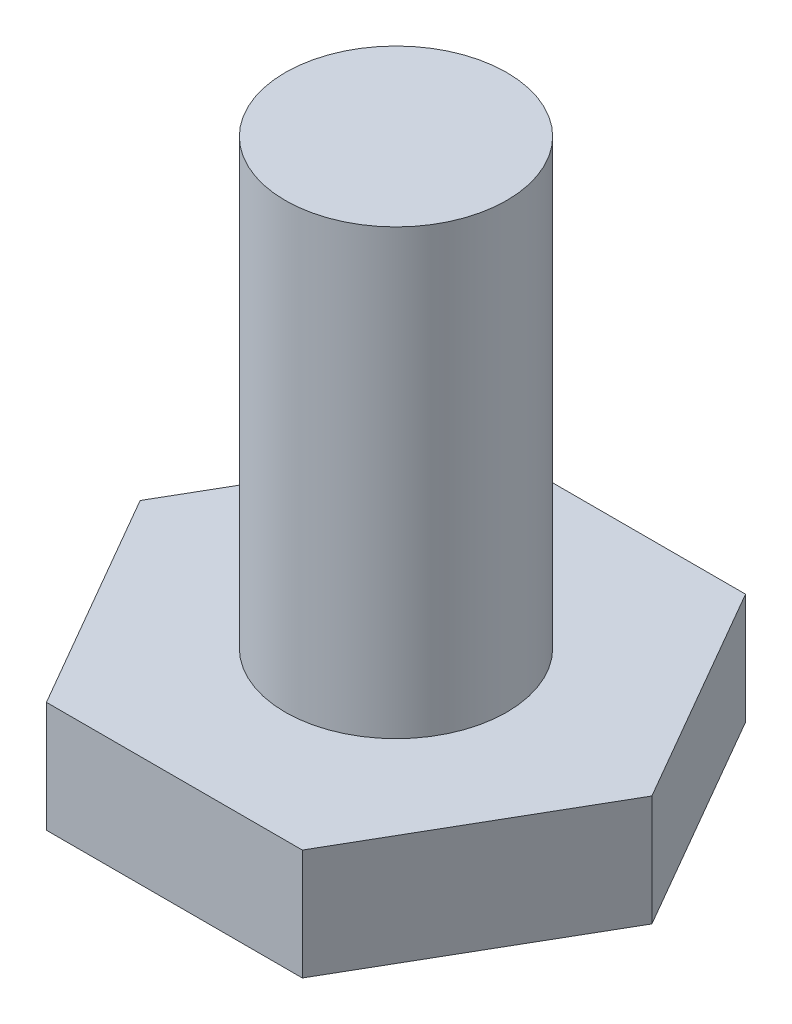
ISO-10303-21;
HEADER;
FILE_DESCRIPTION(('STEP AP214'),'2;1');
FILE_NAME('part.step','',(''),(''),'','','');
FILE_SCHEMA(('AUTOMOTIVE_DESIGN { 1 0 10303 214 1 1 1 1 }'));
ENDSEC;
DATA;
#1=APPLICATION_CONTEXT('core data for automotive mechanical design processes');
#2=APPLICATION_PROTOCOL_DEFINITION('international standard','automotive_design',2000,#1);
#3=PRODUCT_CONTEXT('',#1,'mechanical');
#4=PRODUCT('Part','Part','',(#3));
#5=PRODUCT_RELATED_PRODUCT_CATEGORY('part','',(#4));
#6=PRODUCT_DEFINITION_FORMATION('','',#4);
#7=PRODUCT_DEFINITION_CONTEXT('part definition',#1,'design');
#8=PRODUCT_DEFINITION('design','',#6,#7);
#9=PRODUCT_DEFINITION_SHAPE('','',#8);
#10=(LENGTH_UNIT() NAMED_UNIT(*) SI_UNIT(.MILLI.,.METRE.));
#11=(NAMED_UNIT(*) PLANE_ANGLE_UNIT() SI_UNIT($,.RADIAN.));
#12=(NAMED_UNIT(*) SI_UNIT($,.STERADIAN.) SOLID_ANGLE_UNIT());
#13=UNCERTAINTY_MEASURE_WITH_UNIT(LENGTH_MEASURE(1.E-05),#10,'distance_accuracy_value','');
#14=(GEOMETRIC_REPRESENTATION_CONTEXT(3) GLOBAL_UNCERTAINTY_ASSIGNED_CONTEXT((#13)) GLOBAL_UNIT_ASSIGNED_CONTEXT((#10,
#11,#12)) REPRESENTATION_CONTEXT('',''));
#15=CARTESIAN_POINT('',(0.,0.,0.));
#16=DIRECTION('',(0.,0.,1.));
#17=DIRECTION('',(1.,0.,0.));
#18=AXIS2_PLACEMENT_3D('',#15,#16,#17);
#19=CARTESIAN_POINT('',(2.30940107675851,2.,-4.));
#20=DIRECTION('',(0.,0.,1.));
#21=DIRECTION('',(1.,0.,0.));
#22=AXIS2_PLACEMENT_3D('',#19,#20,#21);
#23=PLANE('',#22);
#24=DIRECTION('',(-1.,0.,0.));
#25=VECTOR('',#24,1.);
#26=CARTESIAN_POINT('',(2.30940107675851,0.,-4.));
#27=LINE('',#26,#25);
#28=CARTESIAN_POINT('',(2.30940107675851,0.,-4.));
#29=VERTEX_POINT('',#28);
#30=CARTESIAN_POINT('',(-2.3094010767585,0.,-4.));
#31=VERTEX_POINT('',#30);
#32=EDGE_CURVE('E121',#29,#31,#27,.T.);
#33=ORIENTED_EDGE('',*,*,#32,.T.);
#34=DIRECTION('',(0.,-1.,0.));
#35=VECTOR('',#34,1.);
#36=CARTESIAN_POINT('',(-2.3094010767585,2.,-4.));
#37=LINE('',#36,#35);
#38=CARTESIAN_POINT('',(-2.3094010767585,2.,-4.));
#39=VERTEX_POINT('',#38);
#40=EDGE_CURVE('E11',#39,#31,#37,.T.);
#41=ORIENTED_EDGE('',*,*,#40,.F.);
#42=DIRECTION('',(-1.,0.,0.));
#43=VECTOR('',#42,1.);
#44=CARTESIAN_POINT('',(2.30940107675851,2.,-4.));
#45=LINE('',#44,#43);
#46=CARTESIAN_POINT('',(2.30940107675851,2.,-4.));
#47=VERTEX_POINT('',#46);
#48=EDGE_CURVE('E132',#47,#39,#45,.T.);
#49=ORIENTED_EDGE('',*,*,#48,.F.);
#50=DIRECTION('',(0.,-1.,0.));
#51=VECTOR('',#50,1.);
#52=CARTESIAN_POINT('',(2.30940107675851,2.,-4.));
#53=LINE('',#52,#51);
#54=EDGE_CURVE('E117',#47,#29,#53,.T.);
#55=ORIENTED_EDGE('',*,*,#54,.T.);
#56=EDGE_LOOP('',(#33,#41,#49,#55));
#57=FACE_BOUND('',#56,.T.);
#58=ADVANCED_FACE('F37',(#57),#23,.F.);
#59=CARTESIAN_POINT('',(-2.3094010767585,2.,-4.));
#60=DIRECTION('',(0.866025403784439,0.,0.5));
#61=DIRECTION('',(0.5,0.,-0.866025403784439));
#62=AXIS2_PLACEMENT_3D('',#59,#60,#61);
#63=PLANE('',#62);
#64=DIRECTION('',(-0.5,0.,0.866025403784438));
#65=VECTOR('',#64,1.);
#66=CARTESIAN_POINT('',(-2.3094010767585,0.,-4.));
#67=LINE('',#66,#65);
#68=CARTESIAN_POINT('',(-4.61880215351701,0.,0.));
#69=VERTEX_POINT('',#68);
#70=EDGE_CURVE('E124',#31,#69,#67,.T.);
#71=ORIENTED_EDGE('',*,*,#70,.T.);
#72=DIRECTION('',(0.,-1.,0.));
#73=VECTOR('',#72,1.);
#74=CARTESIAN_POINT('',(-4.61880215351701,2.,0.));
#75=LINE('',#74,#73);
#76=CARTESIAN_POINT('',(-4.61880215351701,2.,0.));
#77=VERTEX_POINT('',#76);
#78=EDGE_CURVE('E45',#77,#69,#75,.T.);
#79=ORIENTED_EDGE('',*,*,#78,.F.);
#80=DIRECTION('',(-0.5,0.,0.866025403784438));
#81=VECTOR('',#80,1.);
#82=CARTESIAN_POINT('',(-2.3094010767585,2.,-4.));
#83=LINE('',#82,#81);
#84=EDGE_CURVE('E90',#39,#77,#83,.T.);
#85=ORIENTED_EDGE('',*,*,#84,.F.);
#86=ORIENTED_EDGE('',*,*,#40,.T.);
#87=EDGE_LOOP('',(#71,#79,#85,#86));
#88=FACE_BOUND('',#87,.T.);
#89=ADVANCED_FACE('F157',(#88),#63,.F.);
#90=CARTESIAN_POINT('',(-4.61880215351701,2.,0.));
#91=DIRECTION('',(0.866025403784439,0.,-0.5));
#92=DIRECTION('',(-0.5,0.,-0.866025403784439));
#93=AXIS2_PLACEMENT_3D('',#90,#91,#92);
#94=PLANE('',#93);
#95=DIRECTION('',(0.5,0.,0.866025403784439));
#96=VECTOR('',#95,1.);
#97=CARTESIAN_POINT('',(-4.61880215351701,0.,0.));
#98=LINE('',#97,#96);
#99=CARTESIAN_POINT('',(-2.30940107675851,0.,4.));
#100=VERTEX_POINT('',#99);
#101=EDGE_CURVE('E127',#69,#100,#98,.T.);
#102=ORIENTED_EDGE('',*,*,#101,.T.);
#103=DIRECTION('',(0.,-1.,0.));
#104=VECTOR('',#103,1.);
#105=CARTESIAN_POINT('',(-2.30940107675851,2.,4.));
#106=LINE('',#105,#104);
#107=CARTESIAN_POINT('',(-2.30940107675851,2.,4.));
#108=VERTEX_POINT('',#107);
#109=EDGE_CURVE('E112',#108,#100,#106,.T.);
#110=ORIENTED_EDGE('',*,*,#109,.F.);
#111=DIRECTION('',(0.5,0.,0.866025403784439));
#112=VECTOR('',#111,1.);
#113=CARTESIAN_POINT('',(-4.61880215351701,2.,0.));
#114=LINE('',#113,#112);
#115=EDGE_CURVE('E103',#77,#108,#114,.T.);
#116=ORIENTED_EDGE('',*,*,#115,.F.);
#117=ORIENTED_EDGE('',*,*,#78,.T.);
#118=EDGE_LOOP('',(#102,#110,#116,#117));
#119=FACE_BOUND('',#118,.T.);
#120=ADVANCED_FACE('F138',(#119),#94,.F.);
#121=CARTESIAN_POINT('',(-2.30940107675851,2.,4.));
#122=DIRECTION('',(0.,0.,-1.));
#123=DIRECTION('',(-1.,0.,0.));
#124=AXIS2_PLACEMENT_3D('',#121,#122,#123);
#125=PLANE('',#124);
#126=DIRECTION('',(1.,0.,0.));
#127=VECTOR('',#126,1.);
#128=CARTESIAN_POINT('',(-2.30940107675851,0.,4.));
#129=LINE('',#128,#127);
#130=CARTESIAN_POINT('',(2.3094010767585,0.,4.));
#131=VERTEX_POINT('',#130);
#132=EDGE_CURVE('E111',#100,#131,#129,.T.);
#133=ORIENTED_EDGE('',*,*,#132,.T.);
#134=DIRECTION('',(0.,-1.,0.));
#135=VECTOR('',#134,1.);
#136=CARTESIAN_POINT('',(2.3094010767585,2.,4.));
#137=LINE('',#136,#135);
#138=CARTESIAN_POINT('',(2.3094010767585,2.,4.));
#139=VERTEX_POINT('',#138);
#140=EDGE_CURVE('E108',#139,#131,#137,.T.);
#141=ORIENTED_EDGE('',*,*,#140,.F.);
#142=DIRECTION('',(1.,0.,0.));
#143=VECTOR('',#142,1.);
#144=CARTESIAN_POINT('',(-2.30940107675851,2.,4.));
#145=LINE('',#144,#143);
#146=EDGE_CURVE('E97',#108,#139,#145,.T.);
#147=ORIENTED_EDGE('',*,*,#146,.F.);
#148=ORIENTED_EDGE('',*,*,#109,.T.);
#149=EDGE_LOOP('',(#133,#141,#147,#148));
#150=FACE_BOUND('',#149,.T.);
#151=ADVANCED_FACE('F109',(#150),#125,.F.);
#152=CARTESIAN_POINT('',(2.3094010767585,2.,4.));
#153=DIRECTION('',(-0.866025403784439,0.,-0.5));
#154=DIRECTION('',(-0.5,0.,0.866025403784439));
#155=AXIS2_PLACEMENT_3D('',#152,#153,#154);
#156=PLANE('',#155);
#157=DIRECTION('',(0.5,0.,-0.866025403784439));
#158=VECTOR('',#157,1.);
#159=CARTESIAN_POINT('',(2.3094010767585,0.,4.));
#160=LINE('',#159,#158);
#161=CARTESIAN_POINT('',(4.61880215351701,0.,0.));
#162=VERTEX_POINT('',#161);
#163=EDGE_CURVE('E76',#131,#162,#160,.T.);
#164=ORIENTED_EDGE('',*,*,#163,.T.);
#165=DIRECTION('',(0.,-1.,0.));
#166=VECTOR('',#165,1.);
#167=CARTESIAN_POINT('',(4.61880215351701,2.,0.));
#168=LINE('',#167,#166);
#169=CARTESIAN_POINT('',(4.61880215351701,2.,0.));
#170=VERTEX_POINT('',#169);
#171=EDGE_CURVE('E113',#170,#162,#168,.T.);
#172=ORIENTED_EDGE('',*,*,#171,.F.);
#173=DIRECTION('',(0.5,0.,-0.866025403784439));
#174=VECTOR('',#173,1.);
#175=CARTESIAN_POINT('',(2.3094010767585,2.,4.));
#176=LINE('',#175,#174);
#177=EDGE_CURVE('E101',#139,#170,#176,.T.);
#178=ORIENTED_EDGE('',*,*,#177,.F.);
#179=ORIENTED_EDGE('',*,*,#140,.T.);
#180=EDGE_LOOP('',(#164,#172,#178,#179));
#181=FACE_BOUND('',#180,.T.);
#182=ADVANCED_FACE('F115',(#181),#156,.F.);
#183=CARTESIAN_POINT('',(4.61880215351701,2.,0.));
#184=DIRECTION('',(-0.866025403784439,0.,0.5));
#185=DIRECTION('',(0.5,0.,0.866025403784439));
#186=AXIS2_PLACEMENT_3D('',#183,#184,#185);
#187=PLANE('',#186);
#188=DIRECTION('',(-0.5,0.,-0.866025403784439));
#189=VECTOR('',#188,1.);
#190=CARTESIAN_POINT('',(4.61880215351701,0.,0.));
#191=LINE('',#190,#189);
#192=EDGE_CURVE('E82',#162,#29,#191,.T.);
#193=ORIENTED_EDGE('',*,*,#192,.T.);
#194=ORIENTED_EDGE('',*,*,#54,.F.);
#195=DIRECTION('',(-0.5,0.,-0.866025403784439));
#196=VECTOR('',#195,1.);
#197=CARTESIAN_POINT('',(4.61880215351701,2.,0.));
#198=LINE('',#197,#196);
#199=EDGE_CURVE('E53',#170,#47,#198,.T.);
#200=ORIENTED_EDGE('',*,*,#199,.F.);
#201=ORIENTED_EDGE('',*,*,#171,.T.);
#202=EDGE_LOOP('',(#193,#194,#200,#201));
#203=FACE_BOUND('',#202,.T.);
#204=ADVANCED_FACE('F145',(#203),#187,.F.);
#205=CARTESIAN_POINT('',(0.,2.,0.));
#206=DIRECTION('',(0.,1.,0.));
#207=DIRECTION('',(0.,0.,1.));
#208=AXIS2_PLACEMENT_3D('',#205,#206,#207);
#209=PLANE('',#208);
#210=CARTESIAN_POINT('',(0.,2.,0.));
#211=DIRECTION('',(0.,1.,0.));
#212=DIRECTION('',(0.,0.,1.));
#213=AXIS2_PLACEMENT_3D('',#210,#211,#212);
#214=CIRCLE('',#213,2.);
#215=CARTESIAN_POINT('',(0.,2.,2.));
#216=VERTEX_POINT('',#215);
#217=EDGE_CURVE('E125',#216,#216,#214,.F.);
#218=ORIENTED_EDGE('',*,*,#217,.T.);
#219=EDGE_LOOP('',(#218));
#220=FACE_BOUND('',#219,.T.);
#221=ORIENTED_EDGE('',*,*,#48,.T.);
#222=ORIENTED_EDGE('',*,*,#84,.T.);
#223=ORIENTED_EDGE('',*,*,#115,.T.);
#224=ORIENTED_EDGE('',*,*,#146,.T.);
#225=ORIENTED_EDGE('',*,*,#177,.T.);
#226=ORIENTED_EDGE('',*,*,#199,.T.);
#227=EDGE_LOOP('',(#221,#222,#223,#224,#225,#226));
#228=FACE_BOUND('',#227,.T.);
#229=ADVANCED_FACE('F99',(#220,#228),#209,.T.);
#230=CARTESIAN_POINT('',(0.,0.,0.));
#231=DIRECTION('',(0.,1.,0.));
#232=DIRECTION('',(0.,0.,1.));
#233=AXIS2_PLACEMENT_3D('',#230,#231,#232);
#234=PLANE('',#233);
#235=ORIENTED_EDGE('',*,*,#32,.F.);
#236=ORIENTED_EDGE('',*,*,#192,.F.);
#237=ORIENTED_EDGE('',*,*,#163,.F.);
#238=ORIENTED_EDGE('',*,*,#132,.F.);
#239=ORIENTED_EDGE('',*,*,#101,.F.);
#240=ORIENTED_EDGE('',*,*,#70,.F.);
#241=EDGE_LOOP('',(#235,#236,#237,#238,#239,#240));
#242=FACE_BOUND('',#241,.T.);
#243=ADVANCED_FACE('F141',(#242),#234,.F.);
#244=CARTESIAN_POINT('',(0.,10.,0.));
#245=DIRECTION('',(0.,-1.,0.));
#246=DIRECTION('',(0.,0.,-1.));
#247=AXIS2_PLACEMENT_3D('',#244,#245,#246);
#248=CYLINDRICAL_SURFACE('',#247,2.);
#249=ORIENTED_EDGE('',*,*,#217,.F.);
#250=EDGE_LOOP('',(#249));
#251=FACE_BOUND('',#250,.T.);
#252=CARTESIAN_POINT('',(0.,10.,0.));
#253=DIRECTION('',(0.,1.,0.));
#254=DIRECTION('',(0.,0.,1.));
#255=AXIS2_PLACEMENT_3D('',#252,#253,#254);
#256=CIRCLE('',#255,2.);
#257=CARTESIAN_POINT('',(0.,10.,2.));
#258=VERTEX_POINT('',#257);
#259=EDGE_CURVE('E252',#258,#258,#256,.T.);
#260=ORIENTED_EDGE('',*,*,#259,.F.);
#261=EDGE_LOOP('',(#260));
#262=FACE_BOUND('',#261,.T.);
#263=ADVANCED_FACE('F197',(#251,#262),#248,.T.);
#264=CARTESIAN_POINT('',(0.,10.,0.));
#265=DIRECTION('',(0.,1.,0.));
#266=DIRECTION('',(0.,0.,1.));
#267=AXIS2_PLACEMENT_3D('',#264,#265,#266);
#268=PLANE('',#267);
#269=ORIENTED_EDGE('',*,*,#259,.T.);
#270=EDGE_LOOP('',(#269));
#271=FACE_BOUND('',#270,.T.);
#272=ADVANCED_FACE('F206',(#271),#268,.T.);
#273=CLOSED_SHELL('',(#58,#89,#120,#151,#182,#204,#229,#243,#263,#272));
#274=MANIFOLD_SOLID_BREP('B2',#273);
#275=ADVANCED_BREP_SHAPE_REPRESENTATION('',(#18,#274),#14);
#276=SHAPE_DEFINITION_REPRESENTATION(#9,#275);
ENDSEC;
END-ISO-10303-21;
